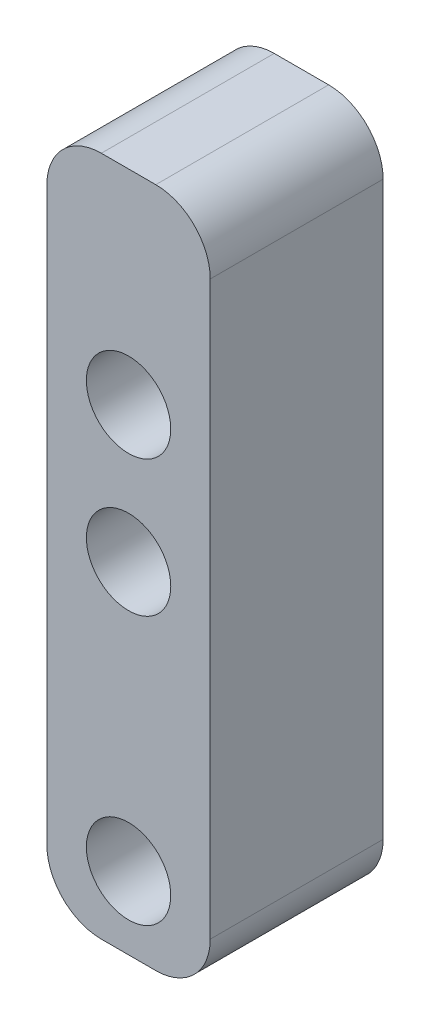
ISO-10303-21;
HEADER;
FILE_DESCRIPTION(('STEP AP214'),'2;1');
FILE_NAME('part.step','',(''),(''),'','','');
FILE_SCHEMA(('AUTOMOTIVE_DESIGN { 1 0 10303 214 1 1 1 1 }'));
ENDSEC;
DATA;
#1=APPLICATION_CONTEXT('core data for automotive mechanical design processes');
#2=APPLICATION_PROTOCOL_DEFINITION('international standard','automotive_design',2000,#1);
#3=PRODUCT_CONTEXT('',#1,'mechanical');
#4=PRODUCT('Part','Part','',(#3));
#5=PRODUCT_RELATED_PRODUCT_CATEGORY('part','',(#4));
#6=PRODUCT_DEFINITION_FORMATION('','',#4);
#7=PRODUCT_DEFINITION_CONTEXT('part definition',#1,'design');
#8=PRODUCT_DEFINITION('design','',#6,#7);
#9=PRODUCT_DEFINITION_SHAPE('','',#8);
#10=(LENGTH_UNIT() NAMED_UNIT(*) SI_UNIT(.MILLI.,.METRE.));
#11=(NAMED_UNIT(*) PLANE_ANGLE_UNIT() SI_UNIT($,.RADIAN.));
#12=(NAMED_UNIT(*) SI_UNIT($,.STERADIAN.) SOLID_ANGLE_UNIT());
#13=UNCERTAINTY_MEASURE_WITH_UNIT(LENGTH_MEASURE(1.E-05),#10,'distance_accuracy_value','');
#14=(GEOMETRIC_REPRESENTATION_CONTEXT(3) GLOBAL_UNCERTAINTY_ASSIGNED_CONTEXT((#13)) GLOBAL_UNIT_ASSIGNED_CONTEXT((#10,
#11,#12)) REPRESENTATION_CONTEXT('',''));
#15=CARTESIAN_POINT('',(0.,0.,0.));
#16=DIRECTION('',(0.,0.,1.));
#17=DIRECTION('',(1.,0.,0.));
#18=AXIS2_PLACEMENT_3D('',#15,#16,#17);
#19=CARTESIAN_POINT('',(0.,0.,6.35));
#20=DIRECTION('',(0.,0.,-1.));
#21=DIRECTION('',(-1.,0.,0.));
#22=AXIS2_PLACEMENT_3D('',#19,#20,#21);
#23=PLANE('',#22);
#24=DIRECTION('',(1.,0.,0.));
#25=VECTOR('',#24,1.);
#26=CARTESIAN_POINT('',(-3.,-12.5,6.35));
#27=LINE('',#26,#25);
#28=CARTESIAN_POINT('',(-1.,-12.5,6.35));
#29=VERTEX_POINT('',#28);
#30=CARTESIAN_POINT('',(1.,-12.5,6.35));
#31=VERTEX_POINT('',#30);
#32=EDGE_CURVE('E136',#29,#31,#27,.T.);
#33=ORIENTED_EDGE('',*,*,#32,.T.);
#34=CARTESIAN_POINT('',(1.,-10.5,6.35));
#35=DIRECTION('',(0.,0.,-1.));
#36=DIRECTION('',(-1.,0.,0.));
#37=AXIS2_PLACEMENT_3D('',#34,#35,#36);
#38=CIRCLE('',#37,2.);
#39=CARTESIAN_POINT('',(3.,-10.5,6.35));
#40=VERTEX_POINT('',#39);
#41=EDGE_CURVE('E155',#31,#40,#38,.F.);
#42=ORIENTED_EDGE('',*,*,#41,.T.);
#43=DIRECTION('',(0.,1.,0.));
#44=VECTOR('',#43,1.);
#45=CARTESIAN_POINT('',(3.,-12.5,6.35));
#46=LINE('',#45,#44);
#47=CARTESIAN_POINT('',(3.,10.5,6.35));
#48=VERTEX_POINT('',#47);
#49=EDGE_CURVE('E119',#40,#48,#46,.T.);
#50=ORIENTED_EDGE('',*,*,#49,.T.);
#51=CARTESIAN_POINT('',(1.,10.5,6.35));
#52=DIRECTION('',(0.,0.,-1.));
#53=DIRECTION('',(-1.,0.,0.));
#54=AXIS2_PLACEMENT_3D('',#51,#52,#53);
#55=CIRCLE('',#54,2.);
#56=CARTESIAN_POINT('',(1.,12.5,6.35));
#57=VERTEX_POINT('',#56);
#58=EDGE_CURVE('E150',#48,#57,#55,.F.);
#59=ORIENTED_EDGE('',*,*,#58,.T.);
#60=DIRECTION('',(-1.,0.,0.));
#61=VECTOR('',#60,1.);
#62=CARTESIAN_POINT('',(-3.,12.5,6.35));
#63=LINE('',#62,#61);
#64=CARTESIAN_POINT('',(-1.,12.5,6.35));
#65=VERTEX_POINT('',#64);
#66=EDGE_CURVE('E166',#57,#65,#63,.T.);
#67=ORIENTED_EDGE('',*,*,#66,.T.);
#68=CARTESIAN_POINT('',(-1.,10.5,6.35));
#69=DIRECTION('',(0.,0.,-1.));
#70=DIRECTION('',(-1.,0.,0.));
#71=AXIS2_PLACEMENT_3D('',#68,#69,#70);
#72=CIRCLE('',#71,2.);
#73=CARTESIAN_POINT('',(-3.,10.5,6.35));
#74=VERTEX_POINT('',#73);
#75=EDGE_CURVE('E55',#65,#74,#72,.F.);
#76=ORIENTED_EDGE('',*,*,#75,.T.);
#77=DIRECTION('',(0.,-1.,0.));
#78=VECTOR('',#77,1.);
#79=CARTESIAN_POINT('',(-3.,-12.5,6.35));
#80=LINE('',#79,#78);
#81=CARTESIAN_POINT('',(-3.,-10.5,6.35));
#82=VERTEX_POINT('',#81);
#83=EDGE_CURVE('E174',#74,#82,#80,.T.);
#84=ORIENTED_EDGE('',*,*,#83,.T.);
#85=CARTESIAN_POINT('',(-1.,-10.5,6.35));
#86=DIRECTION('',(0.,0.,-1.));
#87=DIRECTION('',(-1.,0.,0.));
#88=AXIS2_PLACEMENT_3D('',#85,#86,#87);
#89=CIRCLE('',#88,2.);
#90=EDGE_CURVE('E153',#82,#29,#89,.F.);
#91=ORIENTED_EDGE('',*,*,#90,.T.);
#92=EDGE_LOOP('',(#33,#42,#50,#59,#67,#76,#84,#91));
#93=FACE_BOUND('',#92,.T.);
#94=CARTESIAN_POINT('',(0.,0.,6.35));
#95=DIRECTION('',(0.,0.,1.));
#96=DIRECTION('',(1.,0.,0.));
#97=AXIS2_PLACEMENT_3D('',#94,#95,#96);
#98=CIRCLE('',#97,1.55);
#99=CARTESIAN_POINT('',(1.55,0.,6.35));
#100=VERTEX_POINT('',#99);
#101=EDGE_CURVE('E127',#100,#100,#98,.T.);
#102=ORIENTED_EDGE('',*,*,#101,.F.);
#103=EDGE_LOOP('',(#102));
#104=FACE_BOUND('',#103,.T.);
#105=CARTESIAN_POINT('',(0.,-9.83786506472484,6.35));
#106=DIRECTION('',(0.,0.,1.));
#107=DIRECTION('',(-1.,0.,0.));
#108=AXIS2_PLACEMENT_3D('',#105,#106,#107);
#109=CIRCLE('',#108,1.55);
#110=CARTESIAN_POINT('',(-1.55,-9.83786506472484,6.35));
#111=VERTEX_POINT('',#110);
#112=EDGE_CURVE('E181',#111,#111,#109,.T.);
#113=ORIENTED_EDGE('',*,*,#112,.F.);
#114=EDGE_LOOP('',(#113));
#115=FACE_BOUND('',#114,.T.);
#116=CARTESIAN_POINT('',(0.,5.,6.35));
#117=DIRECTION('',(0.,0.,1.));
#118=DIRECTION('',(1.,0.,0.));
#119=AXIS2_PLACEMENT_3D('',#116,#117,#118);
#120=CIRCLE('',#119,1.55);
#121=CARTESIAN_POINT('',(1.55,5.,6.35));
#122=VERTEX_POINT('',#121);
#123=EDGE_CURVE('E186',#122,#122,#120,.T.);
#124=ORIENTED_EDGE('',*,*,#123,.F.);
#125=EDGE_LOOP('',(#124));
#126=FACE_BOUND('',#125,.T.);
#127=ADVANCED_FACE('F33',(#93,#104,#115,#126),#23,.F.);
#128=CARTESIAN_POINT('',(0.,0.,0.));
#129=DIRECTION('',(0.,0.,-1.));
#130=DIRECTION('',(-1.,0.,0.));
#131=AXIS2_PLACEMENT_3D('',#128,#129,#130);
#132=PLANE('',#131);
#133=CARTESIAN_POINT('',(0.,-9.83786506472484,0.));
#134=DIRECTION('',(0.,0.,1.));
#135=DIRECTION('',(-1.,0.,0.));
#136=AXIS2_PLACEMENT_3D('',#133,#134,#135);
#137=CIRCLE('',#136,1.55);
#138=CARTESIAN_POINT('',(-1.55,-9.83786506472484,0.));
#139=VERTEX_POINT('',#138);
#140=EDGE_CURVE('E183',#139,#139,#137,.T.);
#141=ORIENTED_EDGE('',*,*,#140,.T.);
#142=EDGE_LOOP('',(#141));
#143=FACE_BOUND('',#142,.T.);
#144=DIRECTION('',(0.,1.,0.));
#145=VECTOR('',#144,1.);
#146=CARTESIAN_POINT('',(3.,-12.5,0.));
#147=LINE('',#146,#145);
#148=CARTESIAN_POINT('',(3.,-10.5,0.));
#149=VERTEX_POINT('',#148);
#150=CARTESIAN_POINT('',(3.,10.5,0.));
#151=VERTEX_POINT('',#150);
#152=EDGE_CURVE('E116',#149,#151,#147,.T.);
#153=ORIENTED_EDGE('',*,*,#152,.F.);
#154=CARTESIAN_POINT('',(1.,-10.5,0.));
#155=DIRECTION('',(0.,0.,-1.));
#156=DIRECTION('',(-1.,0.,0.));
#157=AXIS2_PLACEMENT_3D('',#154,#155,#156);
#158=CIRCLE('',#157,2.);
#159=CARTESIAN_POINT('',(1.,-12.5,0.));
#160=VERTEX_POINT('',#159);
#161=EDGE_CURVE('E99',#149,#160,#158,.T.);
#162=ORIENTED_EDGE('',*,*,#161,.T.);
#163=DIRECTION('',(1.,0.,0.));
#164=VECTOR('',#163,1.);
#165=CARTESIAN_POINT('',(-3.,-12.5,0.));
#166=LINE('',#165,#164);
#167=CARTESIAN_POINT('',(-1.,-12.5,0.));
#168=VERTEX_POINT('',#167);
#169=EDGE_CURVE('E140',#168,#160,#166,.T.);
#170=ORIENTED_EDGE('',*,*,#169,.F.);
#171=CARTESIAN_POINT('',(-1.,-10.5,0.));
#172=DIRECTION('',(0.,0.,-1.));
#173=DIRECTION('',(-1.,0.,0.));
#174=AXIS2_PLACEMENT_3D('',#171,#172,#173);
#175=CIRCLE('',#174,2.);
#176=CARTESIAN_POINT('',(-3.,-10.5,0.));
#177=VERTEX_POINT('',#176);
#178=EDGE_CURVE('E110',#168,#177,#175,.T.);
#179=ORIENTED_EDGE('',*,*,#178,.T.);
#180=DIRECTION('',(0.,-1.,0.));
#181=VECTOR('',#180,1.);
#182=CARTESIAN_POINT('',(-3.,-12.5,0.));
#183=LINE('',#182,#181);
#184=CARTESIAN_POINT('',(-3.,10.5,0.));
#185=VERTEX_POINT('',#184);
#186=EDGE_CURVE('E130',#185,#177,#183,.T.);
#187=ORIENTED_EDGE('',*,*,#186,.F.);
#188=CARTESIAN_POINT('',(-1.,10.5,0.));
#189=DIRECTION('',(0.,0.,-1.));
#190=DIRECTION('',(-1.,0.,0.));
#191=AXIS2_PLACEMENT_3D('',#188,#189,#190);
#192=CIRCLE('',#191,2.);
#193=CARTESIAN_POINT('',(-1.,12.5,0.));
#194=VERTEX_POINT('',#193);
#195=EDGE_CURVE('E144',#185,#194,#192,.T.);
#196=ORIENTED_EDGE('',*,*,#195,.T.);
#197=DIRECTION('',(-1.,0.,0.));
#198=VECTOR('',#197,1.);
#199=CARTESIAN_POINT('',(-3.,12.5,0.));
#200=LINE('',#199,#198);
#201=CARTESIAN_POINT('',(1.,12.5,0.));
#202=VERTEX_POINT('',#201);
#203=EDGE_CURVE('E126',#202,#194,#200,.T.);
#204=ORIENTED_EDGE('',*,*,#203,.F.);
#205=CARTESIAN_POINT('',(1.,10.5,0.));
#206=DIRECTION('',(0.,0.,-1.));
#207=DIRECTION('',(-1.,0.,0.));
#208=AXIS2_PLACEMENT_3D('',#205,#206,#207);
#209=CIRCLE('',#208,2.);
#210=EDGE_CURVE('E120',#202,#151,#209,.T.);
#211=ORIENTED_EDGE('',*,*,#210,.T.);
#212=EDGE_LOOP('',(#153,#162,#170,#179,#187,#196,#204,#211));
#213=FACE_BOUND('',#212,.T.);
#214=CARTESIAN_POINT('',(0.,0.,0.));
#215=DIRECTION('',(0.,0.,1.));
#216=DIRECTION('',(1.,0.,0.));
#217=AXIS2_PLACEMENT_3D('',#214,#215,#216);
#218=CIRCLE('',#217,1.55);
#219=CARTESIAN_POINT('',(1.55,0.,0.));
#220=VERTEX_POINT('',#219);
#221=EDGE_CURVE('E133',#220,#220,#218,.T.);
#222=ORIENTED_EDGE('',*,*,#221,.T.);
#223=EDGE_LOOP('',(#222));
#224=FACE_BOUND('',#223,.T.);
#225=CARTESIAN_POINT('',(0.,5.,0.));
#226=DIRECTION('',(0.,0.,1.));
#227=DIRECTION('',(1.,0.,0.));
#228=AXIS2_PLACEMENT_3D('',#225,#226,#227);
#229=CIRCLE('',#228,1.55);
#230=CARTESIAN_POINT('',(1.55,5.,0.));
#231=VERTEX_POINT('',#230);
#232=EDGE_CURVE('E189',#231,#231,#229,.T.);
#233=ORIENTED_EDGE('',*,*,#232,.T.);
#234=EDGE_LOOP('',(#233));
#235=FACE_BOUND('',#234,.T.);
#236=ADVANCED_FACE('F123',(#143,#213,#224,#235),#132,.T.);
#237=CARTESIAN_POINT('',(3.,-12.5,6.35));
#238=DIRECTION('',(-1.,0.,0.));
#239=DIRECTION('',(0.,0.,1.));
#240=AXIS2_PLACEMENT_3D('',#237,#238,#239);
#241=PLANE('',#240);
#242=ORIENTED_EDGE('',*,*,#49,.F.);
#243=DIRECTION('',(0.,0.,-1.));
#244=VECTOR('',#243,1.);
#245=CARTESIAN_POINT('',(3.,-10.5,6.35));
#246=LINE('',#245,#244);
#247=EDGE_CURVE('E103',#40,#149,#246,.T.);
#248=ORIENTED_EDGE('',*,*,#247,.T.);
#249=ORIENTED_EDGE('',*,*,#152,.T.);
#250=DIRECTION('',(0.,0.,-1.));
#251=VECTOR('',#250,1.);
#252=CARTESIAN_POINT('',(3.,10.5,6.35));
#253=LINE('',#252,#251);
#254=EDGE_CURVE('E121',#151,#48,#253,.F.);
#255=ORIENTED_EDGE('',*,*,#254,.T.);
#256=EDGE_LOOP('',(#242,#248,#249,#255));
#257=FACE_BOUND('',#256,.T.);
#258=ADVANCED_FACE('F115',(#257),#241,.F.);
#259=CARTESIAN_POINT('',(-3.,12.5,6.35));
#260=DIRECTION('',(0.,-1.,0.));
#261=DIRECTION('',(0.,0.,-1.));
#262=AXIS2_PLACEMENT_3D('',#259,#260,#261);
#263=PLANE('',#262);
#264=ORIENTED_EDGE('',*,*,#203,.T.);
#265=DIRECTION('',(0.,0.,-1.));
#266=VECTOR('',#265,1.);
#267=CARTESIAN_POINT('',(-1.,12.5,6.35));
#268=LINE('',#267,#266);
#269=EDGE_CURVE('E11',#194,#65,#268,.F.);
#270=ORIENTED_EDGE('',*,*,#269,.T.);
#271=ORIENTED_EDGE('',*,*,#66,.F.);
#272=DIRECTION('',(0.,0.,-1.));
#273=VECTOR('',#272,1.);
#274=CARTESIAN_POINT('',(1.,12.5,6.35));
#275=LINE('',#274,#273);
#276=EDGE_CURVE('E41',#57,#202,#275,.T.);
#277=ORIENTED_EDGE('',*,*,#276,.T.);
#278=EDGE_LOOP('',(#264,#270,#271,#277));
#279=FACE_BOUND('',#278,.T.);
#280=ADVANCED_FACE('F164',(#279),#263,.F.);
#281=CARTESIAN_POINT('',(-3.,-12.5,6.35));
#282=DIRECTION('',(1.,0.,0.));
#283=DIRECTION('',(0.,0.,-1.));
#284=AXIS2_PLACEMENT_3D('',#281,#282,#283);
#285=PLANE('',#284);
#286=ORIENTED_EDGE('',*,*,#186,.T.);
#287=DIRECTION('',(0.,0.,-1.));
#288=VECTOR('',#287,1.);
#289=CARTESIAN_POINT('',(-3.,-10.5,6.35));
#290=LINE('',#289,#288);
#291=EDGE_CURVE('E48',#177,#82,#290,.F.);
#292=ORIENTED_EDGE('',*,*,#291,.T.);
#293=ORIENTED_EDGE('',*,*,#83,.F.);
#294=DIRECTION('',(0.,0.,-1.));
#295=VECTOR('',#294,1.);
#296=CARTESIAN_POINT('',(-3.,10.5,6.35));
#297=LINE('',#296,#295);
#298=EDGE_CURVE('E157',#74,#185,#297,.T.);
#299=ORIENTED_EDGE('',*,*,#298,.T.);
#300=EDGE_LOOP('',(#286,#292,#293,#299));
#301=FACE_BOUND('',#300,.T.);
#302=ADVANCED_FACE('F173',(#301),#285,.F.);
#303=CARTESIAN_POINT('',(-3.,-12.5,6.35));
#304=DIRECTION('',(0.,1.,0.));
#305=DIRECTION('',(0.,0.,1.));
#306=AXIS2_PLACEMENT_3D('',#303,#304,#305);
#307=PLANE('',#306);
#308=ORIENTED_EDGE('',*,*,#169,.T.);
#309=DIRECTION('',(0.,0.,-1.));
#310=VECTOR('',#309,1.);
#311=CARTESIAN_POINT('',(1.,-12.5,6.35));
#312=LINE('',#311,#310);
#313=EDGE_CURVE('E104',#160,#31,#312,.F.);
#314=ORIENTED_EDGE('',*,*,#313,.T.);
#315=ORIENTED_EDGE('',*,*,#32,.F.);
#316=DIRECTION('',(0.,0.,-1.));
#317=VECTOR('',#316,1.);
#318=CARTESIAN_POINT('',(-1.,-12.5,6.35));
#319=LINE('',#318,#317);
#320=EDGE_CURVE('E109',#29,#168,#319,.T.);
#321=ORIENTED_EDGE('',*,*,#320,.T.);
#322=EDGE_LOOP('',(#308,#314,#315,#321));
#323=FACE_BOUND('',#322,.T.);
#324=ADVANCED_FACE('F210',(#323),#307,.F.);
#325=CARTESIAN_POINT('',(0.,0.,6.35));
#326=DIRECTION('',(0.,0.,-1.));
#327=DIRECTION('',(-1.,0.,0.));
#328=AXIS2_PLACEMENT_3D('',#325,#326,#327);
#329=CYLINDRICAL_SURFACE('',#328,1.55);
#330=ORIENTED_EDGE('',*,*,#101,.T.);
#331=EDGE_LOOP('',(#330));
#332=FACE_BOUND('',#331,.T.);
#333=ORIENTED_EDGE('',*,*,#221,.F.);
#334=EDGE_LOOP('',(#333));
#335=FACE_BOUND('',#334,.T.);
#336=ADVANCED_FACE('F207',(#332,#335),#329,.F.);
#337=CARTESIAN_POINT('',(0.,-9.83786506472484,6.35));
#338=DIRECTION('',(0.,0.,-1.));
#339=DIRECTION('',(-1.,0.,0.));
#340=AXIS2_PLACEMENT_3D('',#337,#338,#339);
#341=CYLINDRICAL_SURFACE('',#340,1.55);
#342=ORIENTED_EDGE('',*,*,#112,.T.);
#343=EDGE_LOOP('',(#342));
#344=FACE_BOUND('',#343,.T.);
#345=ORIENTED_EDGE('',*,*,#140,.F.);
#346=EDGE_LOOP('',(#345));
#347=FACE_BOUND('',#346,.T.);
#348=ADVANCED_FACE('F294',(#344,#347),#341,.F.);
#349=CARTESIAN_POINT('',(0.,5.,6.35));
#350=DIRECTION('',(0.,0.,-1.));
#351=DIRECTION('',(-1.,0.,0.));
#352=AXIS2_PLACEMENT_3D('',#349,#350,#351);
#353=CYLINDRICAL_SURFACE('',#352,1.55);
#354=ORIENTED_EDGE('',*,*,#123,.T.);
#355=EDGE_LOOP('',(#354));
#356=FACE_BOUND('',#355,.T.);
#357=ORIENTED_EDGE('',*,*,#232,.F.);
#358=EDGE_LOOP('',(#357));
#359=FACE_BOUND('',#358,.T.);
#360=ADVANCED_FACE('F195',(#356,#359),#353,.F.);
#361=CARTESIAN_POINT('',(1.,-10.5,6.35));
#362=DIRECTION('',(0.,0.,-1.));
#363=DIRECTION('',(-1.,0.,0.));
#364=AXIS2_PLACEMENT_3D('',#361,#362,#363);
#365=CYLINDRICAL_SURFACE('',#364,2.);
#366=ORIENTED_EDGE('',*,*,#41,.F.);
#367=ORIENTED_EDGE('',*,*,#313,.F.);
#368=ORIENTED_EDGE('',*,*,#161,.F.);
#369=ORIENTED_EDGE('',*,*,#247,.F.);
#370=EDGE_LOOP('',(#366,#367,#368,#369));
#371=FACE_BOUND('',#370,.T.);
#372=ADVANCED_FACE('F102',(#371),#365,.T.);
#373=CARTESIAN_POINT('',(-1.,-10.5,6.35));
#374=DIRECTION('',(0.,0.,-1.));
#375=DIRECTION('',(-1.,0.,0.));
#376=AXIS2_PLACEMENT_3D('',#373,#374,#375);
#377=CYLINDRICAL_SURFACE('',#376,2.);
#378=ORIENTED_EDGE('',*,*,#90,.F.);
#379=ORIENTED_EDGE('',*,*,#291,.F.);
#380=ORIENTED_EDGE('',*,*,#178,.F.);
#381=ORIENTED_EDGE('',*,*,#320,.F.);
#382=EDGE_LOOP('',(#378,#379,#380,#381));
#383=FACE_BOUND('',#382,.T.);
#384=ADVANCED_FACE('F222',(#383),#377,.T.);
#385=CARTESIAN_POINT('',(-1.,10.5,6.35));
#386=DIRECTION('',(0.,0.,-1.));
#387=DIRECTION('',(-1.,0.,0.));
#388=AXIS2_PLACEMENT_3D('',#385,#386,#387);
#389=CYLINDRICAL_SURFACE('',#388,2.);
#390=ORIENTED_EDGE('',*,*,#75,.F.);
#391=ORIENTED_EDGE('',*,*,#269,.F.);
#392=ORIENTED_EDGE('',*,*,#195,.F.);
#393=ORIENTED_EDGE('',*,*,#298,.F.);
#394=EDGE_LOOP('',(#390,#391,#392,#393));
#395=FACE_BOUND('',#394,.T.);
#396=ADVANCED_FACE('F172',(#395),#389,.T.);
#397=CARTESIAN_POINT('',(1.,10.5,6.35));
#398=DIRECTION('',(0.,0.,-1.));
#399=DIRECTION('',(-1.,0.,0.));
#400=AXIS2_PLACEMENT_3D('',#397,#398,#399);
#401=CYLINDRICAL_SURFACE('',#400,2.);
#402=ORIENTED_EDGE('',*,*,#58,.F.);
#403=ORIENTED_EDGE('',*,*,#254,.F.);
#404=ORIENTED_EDGE('',*,*,#210,.F.);
#405=ORIENTED_EDGE('',*,*,#276,.F.);
#406=EDGE_LOOP('',(#402,#403,#404,#405));
#407=FACE_BOUND('',#406,.T.);
#408=ADVANCED_FACE('F35',(#407),#401,.T.);
#409=CLOSED_SHELL('',(#127,#236,#258,#280,#302,#324,#336,#348,#360,#372,#384,#396,#408));
#410=MANIFOLD_SOLID_BREP('B2',#409);
#411=ADVANCED_BREP_SHAPE_REPRESENTATION('',(#18,#410),#14);
#412=SHAPE_DEFINITION_REPRESENTATION(#9,#411);
ENDSEC;
END-ISO-10303-21;
